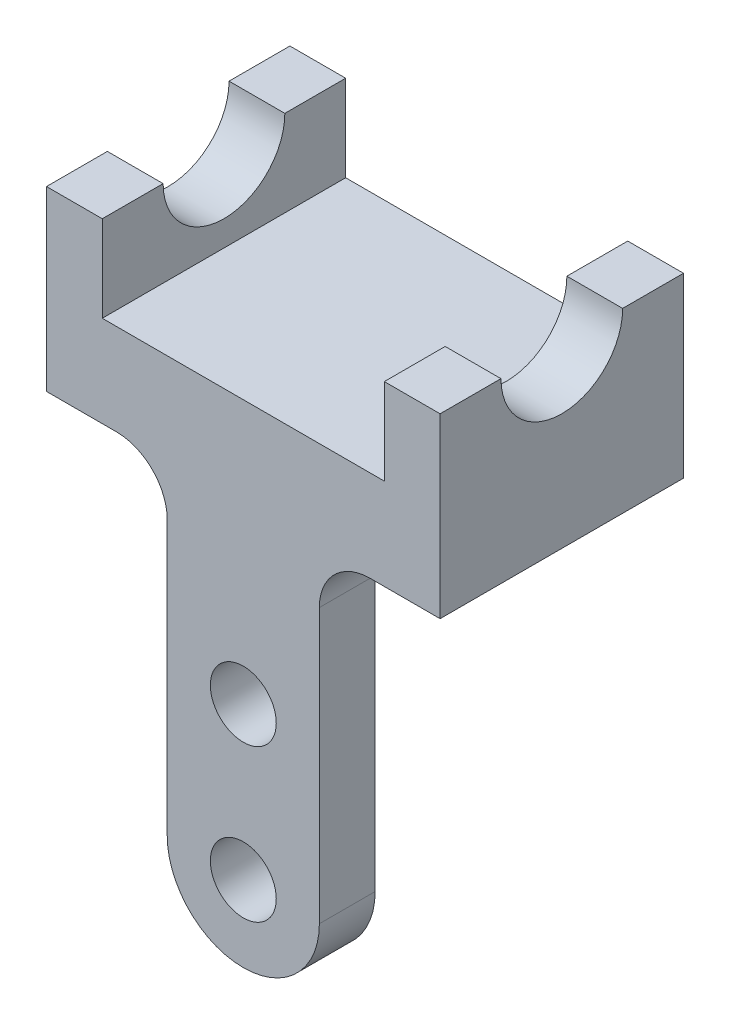
ISO-10303-21;
HEADER;
FILE_DESCRIPTION(('STEP AP214'),'2;1');
FILE_NAME('part.step','',(''),(''),'','','');
FILE_SCHEMA(('AUTOMOTIVE_DESIGN { 1 0 10303 214 1 1 1 1 }'));
ENDSEC;
DATA;
#1=APPLICATION_CONTEXT('core data for automotive mechanical design processes');
#2=APPLICATION_PROTOCOL_DEFINITION('international standard','automotive_design',2000,#1);
#3=PRODUCT_CONTEXT('',#1,'mechanical');
#4=PRODUCT('Part','Part','',(#3));
#5=PRODUCT_RELATED_PRODUCT_CATEGORY('part','',(#4));
#6=PRODUCT_DEFINITION_FORMATION('','',#4);
#7=PRODUCT_DEFINITION_CONTEXT('part definition',#1,'design');
#8=PRODUCT_DEFINITION('design','',#6,#7);
#9=PRODUCT_DEFINITION_SHAPE('','',#8);
#10=(LENGTH_UNIT() NAMED_UNIT(*) SI_UNIT(.MILLI.,.METRE.));
#11=(NAMED_UNIT(*) PLANE_ANGLE_UNIT() SI_UNIT($,.RADIAN.));
#12=(NAMED_UNIT(*) SI_UNIT($,.STERADIAN.) SOLID_ANGLE_UNIT());
#13=UNCERTAINTY_MEASURE_WITH_UNIT(LENGTH_MEASURE(1.E-05),#10,'distance_accuracy_value','');
#14=(GEOMETRIC_REPRESENTATION_CONTEXT(3) GLOBAL_UNCERTAINTY_ASSIGNED_CONTEXT((#13)) GLOBAL_UNIT_ASSIGNED_CONTEXT((#10,
#11,#12)) REPRESENTATION_CONTEXT('',''));
#15=CARTESIAN_POINT('',(0.,0.,0.));
#16=DIRECTION('',(0.,0.,1.));
#17=DIRECTION('',(1.,0.,0.));
#18=AXIS2_PLACEMENT_3D('',#15,#16,#17);
#19=CARTESIAN_POINT('',(0.,99.,-48.));
#20=DIRECTION('',(0.,1.,0.));
#21=DIRECTION('',(0.,0.,1.));
#22=AXIS2_PLACEMENT_3D('',#19,#20,#21);
#23=PLANE('',#22);
#24=DIRECTION('',(1.,0.,0.));
#25=VECTOR('',#24,1.);
#26=CARTESIAN_POINT('',(-38.8107599552078,99.,-12.));
#27=LINE('',#26,#25);
#28=CARTESIAN_POINT('',(27.8107599552078,99.,-12.));
#29=VERTEX_POINT('',#28);
#30=CARTESIAN_POINT('',(38.8107599552078,99.,-12.));
#31=VERTEX_POINT('',#30);
#32=EDGE_CURVE('E371',#29,#31,#27,.T.);
#33=ORIENTED_EDGE('',*,*,#32,.F.);
#34=DIRECTION('',(0.,0.,1.));
#35=VECTOR('',#34,1.);
#36=CARTESIAN_POINT('',(27.8107599552078,99.,-48.));
#37=LINE('',#36,#35);
#38=CARTESIAN_POINT('',(27.8107599552078,99.,0.));
#39=VERTEX_POINT('',#38);
#40=EDGE_CURVE('E288',#29,#39,#37,.T.);
#41=ORIENTED_EDGE('',*,*,#40,.T.);
#42=DIRECTION('',(-1.,0.,0.));
#43=VECTOR('',#42,1.);
#44=CARTESIAN_POINT('',(0.,99.,0.));
#45=LINE('',#44,#43);
#46=CARTESIAN_POINT('',(38.8107599552078,99.,0.));
#47=VERTEX_POINT('',#46);
#48=EDGE_CURVE('E274',#47,#39,#45,.T.);
#49=ORIENTED_EDGE('',*,*,#48,.F.);
#50=DIRECTION('',(0.,0.,1.));
#51=VECTOR('',#50,1.);
#52=CARTESIAN_POINT('',(38.8107599552078,99.,-48.));
#53=LINE('',#52,#51);
#54=EDGE_CURVE('E289',#31,#47,#53,.T.);
#55=ORIENTED_EDGE('',*,*,#54,.F.);
#56=EDGE_LOOP('',(#33,#41,#49,#55));
#57=FACE_BOUND('',#56,.T.);
#58=ADVANCED_FACE('F39',(#57),#23,.T.);
#59=CARTESIAN_POINT('',(0.,99.,-48.));
#60=DIRECTION('',(0.,-1.,0.));
#61=DIRECTION('',(0.,0.,-1.));
#62=AXIS2_PLACEMENT_3D('',#59,#60,#61);
#63=PLANE('',#62);
#64=DIRECTION('',(0.,0.,1.));
#65=VECTOR('',#64,1.);
#66=CARTESIAN_POINT('',(-38.8107599552078,99.,-48.));
#67=LINE('',#66,#65);
#68=CARTESIAN_POINT('',(-38.8107599552078,99.,-48.));
#69=VERTEX_POINT('',#68);
#70=CARTESIAN_POINT('',(-38.8107599552078,99.,-36.));
#71=VERTEX_POINT('',#70);
#72=EDGE_CURVE('E178',#69,#71,#67,.T.);
#73=ORIENTED_EDGE('',*,*,#72,.T.);
#74=DIRECTION('',(1.,0.,0.));
#75=VECTOR('',#74,1.);
#76=CARTESIAN_POINT('',(-38.8107599552078,99.,-36.));
#77=LINE('',#76,#75);
#78=CARTESIAN_POINT('',(-27.8107599552078,99.,-36.));
#79=VERTEX_POINT('',#78);
#80=EDGE_CURVE('E161',#71,#79,#77,.T.);
#81=ORIENTED_EDGE('',*,*,#80,.T.);
#82=DIRECTION('',(0.,0.,1.));
#83=VECTOR('',#82,1.);
#84=CARTESIAN_POINT('',(-27.8107599552078,99.,-48.));
#85=LINE('',#84,#83);
#86=CARTESIAN_POINT('',(-27.8107599552078,99.,-48.));
#87=VERTEX_POINT('',#86);
#88=EDGE_CURVE('E189',#87,#79,#85,.T.);
#89=ORIENTED_EDGE('',*,*,#88,.F.);
#90=DIRECTION('',(1.,0.,0.));
#91=VECTOR('',#90,1.);
#92=CARTESIAN_POINT('',(0.,99.,-48.));
#93=LINE('',#92,#91);
#94=EDGE_CURVE('E185',#69,#87,#93,.T.);
#95=ORIENTED_EDGE('',*,*,#94,.F.);
#96=EDGE_LOOP('',(#73,#81,#89,#95));
#97=FACE_BOUND('',#96,.T.);
#98=ADVANCED_FACE('F182',(#97),#63,.F.);
#99=CARTESIAN_POINT('',(25.,54.,-11.));
#100=DIRECTION('',(0.,0.,1.));
#101=DIRECTION('',(1.,0.,0.));
#102=AXIS2_PLACEMENT_3D('',#99,#100,#101);
#103=CYLINDRICAL_SURFACE('',#102,9.99999999999999);
#104=CARTESIAN_POINT('',(25.,54.,0.));
#105=DIRECTION('',(0.,0.,1.));
#106=DIRECTION('',(1.,0.,0.));
#107=AXIS2_PLACEMENT_3D('',#104,#105,#106);
#108=CIRCLE('',#107,9.99999999999999);
#109=CARTESIAN_POINT('',(15.,54.,0.));
#110=VERTEX_POINT('',#109);
#111=CARTESIAN_POINT('',(25.,64.,0.));
#112=VERTEX_POINT('',#111);
#113=EDGE_CURVE('E199',#110,#112,#108,.F.);
#114=ORIENTED_EDGE('',*,*,#113,.F.);
#115=DIRECTION('',(0.,0.,1.));
#116=VECTOR('',#115,1.);
#117=CARTESIAN_POINT('',(15.,54.,-11.));
#118=LINE('',#117,#116);
#119=CARTESIAN_POINT('',(15.,54.,-11.));
#120=VERTEX_POINT('',#119);
#121=EDGE_CURVE('E244',#120,#110,#118,.T.);
#122=ORIENTED_EDGE('',*,*,#121,.F.);
#123=CARTESIAN_POINT('',(25.,54.,-11.));
#124=DIRECTION('',(0.,0.,1.));
#125=DIRECTION('',(1.,0.,0.));
#126=AXIS2_PLACEMENT_3D('',#123,#124,#125);
#127=CIRCLE('',#126,9.99999999999999);
#128=CARTESIAN_POINT('',(25.,64.,-11.));
#129=VERTEX_POINT('',#128);
#130=EDGE_CURVE('E217',#120,#129,#127,.F.);
#131=ORIENTED_EDGE('',*,*,#130,.T.);
#132=DIRECTION('',(0.,0.,1.));
#133=VECTOR('',#132,1.);
#134=CARTESIAN_POINT('',(25.,64.,-11.));
#135=LINE('',#134,#133);
#136=EDGE_CURVE('E50',#129,#112,#135,.T.);
#137=ORIENTED_EDGE('',*,*,#136,.T.);
#138=EDGE_LOOP('',(#114,#122,#131,#137));
#139=FACE_BOUND('',#138,.T.);
#140=ADVANCED_FACE('F301',(#139),#103,.F.);
#141=CARTESIAN_POINT('',(15.,0.,-11.));
#142=DIRECTION('',(1.,0.,0.));
#143=DIRECTION('',(0.,0.,-1.));
#144=AXIS2_PLACEMENT_3D('',#141,#142,#143);
#145=PLANE('',#144);
#146=DIRECTION('',(0.,1.,0.));
#147=VECTOR('',#146,1.);
#148=CARTESIAN_POINT('',(15.,0.,0.));
#149=LINE('',#148,#147);
#150=CARTESIAN_POINT('',(15.,0.,0.));
#151=VERTEX_POINT('',#150);
#152=EDGE_CURVE('E240',#151,#110,#149,.T.);
#153=ORIENTED_EDGE('',*,*,#152,.F.);
#154=DIRECTION('',(0.,0.,1.));
#155=VECTOR('',#154,1.);
#156=CARTESIAN_POINT('',(15.,0.,-11.));
#157=LINE('',#156,#155);
#158=CARTESIAN_POINT('',(15.,0.,-11.));
#159=VERTEX_POINT('',#158);
#160=EDGE_CURVE('E243',#159,#151,#157,.T.);
#161=ORIENTED_EDGE('',*,*,#160,.F.);
#162=DIRECTION('',(0.,1.,0.));
#163=VECTOR('',#162,1.);
#164=CARTESIAN_POINT('',(15.,0.,-11.));
#165=LINE('',#164,#163);
#166=EDGE_CURVE('E214',#159,#120,#165,.T.);
#167=ORIENTED_EDGE('',*,*,#166,.T.);
#168=ORIENTED_EDGE('',*,*,#121,.T.);
#169=EDGE_LOOP('',(#153,#161,#167,#168));
#170=FACE_BOUND('',#169,.T.);
#171=ADVANCED_FACE('F317',(#170),#145,.T.);
#172=CARTESIAN_POINT('',(0.,0.,-11.));
#173=DIRECTION('',(0.,0.,1.));
#174=DIRECTION('',(1.,0.,0.));
#175=AXIS2_PLACEMENT_3D('',#172,#173,#174);
#176=CYLINDRICAL_SURFACE('',#175,15.);
#177=CARTESIAN_POINT('',(0.,0.,0.));
#178=DIRECTION('',(0.,0.,1.));
#179=DIRECTION('',(1.,0.,0.));
#180=AXIS2_PLACEMENT_3D('',#177,#178,#179);
#181=CIRCLE('',#180,15.);
#182=CARTESIAN_POINT('',(-15.,0.,0.));
#183=VERTEX_POINT('',#182);
#184=EDGE_CURVE('E234',#183,#151,#181,.T.);
#185=ORIENTED_EDGE('',*,*,#184,.F.);
#186=DIRECTION('',(0.,0.,1.));
#187=VECTOR('',#186,1.);
#188=CARTESIAN_POINT('',(-15.,0.,-11.));
#189=LINE('',#188,#187);
#190=CARTESIAN_POINT('',(-15.,0.,-11.));
#191=VERTEX_POINT('',#190);
#192=EDGE_CURVE('E250',#191,#183,#189,.T.);
#193=ORIENTED_EDGE('',*,*,#192,.F.);
#194=CARTESIAN_POINT('',(0.,0.,-11.));
#195=DIRECTION('',(0.,0.,1.));
#196=DIRECTION('',(1.,0.,0.));
#197=AXIS2_PLACEMENT_3D('',#194,#195,#196);
#198=CIRCLE('',#197,15.);
#199=EDGE_CURVE('E215',#191,#159,#198,.T.);
#200=ORIENTED_EDGE('',*,*,#199,.T.);
#201=ORIENTED_EDGE('',*,*,#160,.T.);
#202=EDGE_LOOP('',(#185,#193,#200,#201));
#203=FACE_BOUND('',#202,.T.);
#204=ADVANCED_FACE('F316',(#203),#176,.T.);
#205=CARTESIAN_POINT('',(-15.,0.,-11.));
#206=DIRECTION('',(1.,0.,0.));
#207=DIRECTION('',(0.,0.,-1.));
#208=AXIS2_PLACEMENT_3D('',#205,#206,#207);
#209=PLANE('',#208);
#210=DIRECTION('',(0.,1.,0.));
#211=VECTOR('',#210,1.);
#212=CARTESIAN_POINT('',(-15.,0.,0.));
#213=LINE('',#212,#211);
#214=CARTESIAN_POINT('',(-15.,54.,0.));
#215=VERTEX_POINT('',#214);
#216=EDGE_CURVE('E233',#183,#215,#213,.T.);
#217=ORIENTED_EDGE('',*,*,#216,.T.);
#218=DIRECTION('',(0.,0.,1.));
#219=VECTOR('',#218,1.);
#220=CARTESIAN_POINT('',(-15.,54.,-11.));
#221=LINE('',#220,#219);
#222=CARTESIAN_POINT('',(-15.,54.,-11.));
#223=VERTEX_POINT('',#222);
#224=EDGE_CURVE('E249',#223,#215,#221,.T.);
#225=ORIENTED_EDGE('',*,*,#224,.F.);
#226=DIRECTION('',(0.,1.,0.));
#227=VECTOR('',#226,1.);
#228=CARTESIAN_POINT('',(-15.,0.,-11.));
#229=LINE('',#228,#227);
#230=EDGE_CURVE('E207',#191,#223,#229,.T.);
#231=ORIENTED_EDGE('',*,*,#230,.F.);
#232=ORIENTED_EDGE('',*,*,#192,.T.);
#233=EDGE_LOOP('',(#217,#225,#231,#232));
#234=FACE_BOUND('',#233,.T.);
#235=ADVANCED_FACE('F311',(#234),#209,.F.);
#236=CARTESIAN_POINT('',(0.,0.,-11.));
#237=DIRECTION('',(0.,0.,1.));
#238=DIRECTION('',(1.,0.,0.));
#239=AXIS2_PLACEMENT_3D('',#236,#237,#238);
#240=CYLINDRICAL_SURFACE('',#239,6.5);
#241=CARTESIAN_POINT('',(0.,0.,-11.));
#242=DIRECTION('',(0.,0.,1.));
#243=DIRECTION('',(1.,0.,0.));
#244=AXIS2_PLACEMENT_3D('',#241,#242,#243);
#245=CIRCLE('',#244,6.5);
#246=CARTESIAN_POINT('',(6.5,0.,-11.));
#247=VERTEX_POINT('',#246);
#248=EDGE_CURVE('E200',#247,#247,#245,.T.);
#249=ORIENTED_EDGE('',*,*,#248,.F.);
#250=EDGE_LOOP('',(#249));
#251=FACE_BOUND('',#250,.T.);
#252=CARTESIAN_POINT('',(0.,0.,0.));
#253=DIRECTION('',(0.,0.,1.));
#254=DIRECTION('',(1.,0.,0.));
#255=AXIS2_PLACEMENT_3D('',#252,#253,#254);
#256=CIRCLE('',#255,6.5);
#257=CARTESIAN_POINT('',(6.5,0.,0.));
#258=VERTEX_POINT('',#257);
#259=EDGE_CURVE('E223',#258,#258,#256,.T.);
#260=ORIENTED_EDGE('',*,*,#259,.T.);
#261=EDGE_LOOP('',(#260));
#262=FACE_BOUND('',#261,.T.);
#263=ADVANCED_FACE('F422',(#251,#262),#240,.F.);
#264=CARTESIAN_POINT('',(0.,30.,-11.));
#265=DIRECTION('',(0.,0.,1.));
#266=DIRECTION('',(1.,0.,0.));
#267=AXIS2_PLACEMENT_3D('',#264,#265,#266);
#268=CYLINDRICAL_SURFACE('',#267,6.5);
#269=CARTESIAN_POINT('',(0.,30.,-11.));
#270=DIRECTION('',(0.,0.,1.));
#271=DIRECTION('',(1.,0.,0.));
#272=AXIS2_PLACEMENT_3D('',#269,#270,#271);
#273=CIRCLE('',#272,6.5);
#274=CARTESIAN_POINT('',(6.50000000000001,30.,-11.));
#275=VERTEX_POINT('',#274);
#276=EDGE_CURVE('E198',#275,#275,#273,.T.);
#277=ORIENTED_EDGE('',*,*,#276,.F.);
#278=EDGE_LOOP('',(#277));
#279=FACE_BOUND('',#278,.T.);
#280=CARTESIAN_POINT('',(0.,30.,0.));
#281=DIRECTION('',(0.,0.,1.));
#282=DIRECTION('',(1.,0.,0.));
#283=AXIS2_PLACEMENT_3D('',#280,#281,#282);
#284=CIRCLE('',#283,6.5);
#285=CARTESIAN_POINT('',(6.50000000000001,30.,0.));
#286=VERTEX_POINT('',#285);
#287=EDGE_CURVE('E225',#286,#286,#284,.T.);
#288=ORIENTED_EDGE('',*,*,#287,.T.);
#289=EDGE_LOOP('',(#288));
#290=FACE_BOUND('',#289,.T.);
#291=ADVANCED_FACE('F41',(#279,#290),#268,.F.);
#292=CARTESIAN_POINT('',(-25.,54.,-11.));
#293=DIRECTION('',(0.,0.,1.));
#294=DIRECTION('',(1.,0.,0.));
#295=AXIS2_PLACEMENT_3D('',#292,#293,#294);
#296=CYLINDRICAL_SURFACE('',#295,9.99999999999999);
#297=CARTESIAN_POINT('',(-25.,54.,0.));
#298=DIRECTION('',(0.,0.,1.));
#299=DIRECTION('',(1.,0.,0.));
#300=AXIS2_PLACEMENT_3D('',#297,#298,#299);
#301=CIRCLE('',#300,9.99999999999999);
#302=CARTESIAN_POINT('',(-25.,64.,0.));
#303=VERTEX_POINT('',#302);
#304=EDGE_CURVE('E226',#215,#303,#301,.T.);
#305=ORIENTED_EDGE('',*,*,#304,.T.);
#306=DIRECTION('',(0.,0.,1.));
#307=VECTOR('',#306,1.);
#308=CARTESIAN_POINT('',(-25.,64.,-11.));
#309=LINE('',#308,#307);
#310=CARTESIAN_POINT('',(-25.,64.,-11.));
#311=VERTEX_POINT('',#310);
#312=EDGE_CURVE('E222',#311,#303,#309,.T.);
#313=ORIENTED_EDGE('',*,*,#312,.F.);
#314=CARTESIAN_POINT('',(-25.,54.,-11.));
#315=DIRECTION('',(0.,0.,1.));
#316=DIRECTION('',(1.,0.,0.));
#317=AXIS2_PLACEMENT_3D('',#314,#315,#316);
#318=CIRCLE('',#317,9.99999999999999);
#319=EDGE_CURVE('E206',#223,#311,#318,.T.);
#320=ORIENTED_EDGE('',*,*,#319,.F.);
#321=ORIENTED_EDGE('',*,*,#224,.T.);
#322=EDGE_LOOP('',(#305,#313,#320,#321));
#323=FACE_BOUND('',#322,.T.);
#324=ADVANCED_FACE('F313',(#323),#296,.F.);
#325=CARTESIAN_POINT('',(0.,0.,-11.));
#326=DIRECTION('',(0.,0.,1.));
#327=DIRECTION('',(1.,0.,0.));
#328=AXIS2_PLACEMENT_3D('',#325,#326,#327);
#329=PLANE('',#328);
#330=ORIENTED_EDGE('',*,*,#276,.T.);
#331=EDGE_LOOP('',(#330));
#332=FACE_BOUND('',#331,.T.);
#333=ORIENTED_EDGE('',*,*,#248,.T.);
#334=EDGE_LOOP('',(#333));
#335=FACE_BOUND('',#334,.T.);
#336=DIRECTION('',(-1.,0.,0.));
#337=VECTOR('',#336,1.);
#338=CARTESIAN_POINT('',(0.,64.,-11.));
#339=LINE('',#338,#337);
#340=EDGE_CURVE('E201',#129,#311,#339,.T.);
#341=ORIENTED_EDGE('',*,*,#340,.F.);
#342=ORIENTED_EDGE('',*,*,#130,.F.);
#343=ORIENTED_EDGE('',*,*,#166,.F.);
#344=ORIENTED_EDGE('',*,*,#199,.F.);
#345=ORIENTED_EDGE('',*,*,#230,.T.);
#346=ORIENTED_EDGE('',*,*,#319,.T.);
#347=EDGE_LOOP('',(#341,#342,#343,#344,#345,#346));
#348=FACE_BOUND('',#347,.T.);
#349=ADVANCED_FACE('F307',(#332,#335,#348),#329,.F.);
#350=CARTESIAN_POINT('',(0.,0.,0.));
#351=DIRECTION('',(0.,0.,1.));
#352=DIRECTION('',(1.,0.,0.));
#353=AXIS2_PLACEMENT_3D('',#350,#351,#352);
#354=PLANE('',#353);
#355=ORIENTED_EDGE('',*,*,#287,.F.);
#356=EDGE_LOOP('',(#355));
#357=FACE_BOUND('',#356,.T.);
#358=ORIENTED_EDGE('',*,*,#259,.F.);
#359=EDGE_LOOP('',(#358));
#360=FACE_BOUND('',#359,.T.);
#361=ORIENTED_EDGE('',*,*,#113,.T.);
#362=DIRECTION('',(-1.,0.,0.));
#363=VECTOR('',#362,1.);
#364=CARTESIAN_POINT('',(0.,64.,0.));
#365=LINE('',#364,#363);
#366=CARTESIAN_POINT('',(38.8107599552078,64.,0.));
#367=VERTEX_POINT('',#366);
#368=EDGE_CURVE('E264',#367,#112,#365,.T.);
#369=ORIENTED_EDGE('',*,*,#368,.F.);
#370=DIRECTION('',(0.,1.,0.));
#371=VECTOR('',#370,1.);
#372=CARTESIAN_POINT('',(38.8107599552078,0.,0.));
#373=LINE('',#372,#371);
#374=EDGE_CURVE('E268',#367,#47,#373,.T.);
#375=ORIENTED_EDGE('',*,*,#374,.T.);
#376=ORIENTED_EDGE('',*,*,#48,.T.);
#377=DIRECTION('',(0.,-1.,0.));
#378=VECTOR('',#377,1.);
#379=CARTESIAN_POINT('',(27.8107599552079,0.,0.));
#380=LINE('',#379,#378);
#381=CARTESIAN_POINT('',(27.8107599552078,82.,0.));
#382=VERTEX_POINT('',#381);
#383=EDGE_CURVE('E279',#39,#382,#380,.T.);
#384=ORIENTED_EDGE('',*,*,#383,.T.);
#385=DIRECTION('',(-1.,0.,0.));
#386=VECTOR('',#385,1.);
#387=CARTESIAN_POINT('',(0.,82.,0.));
#388=LINE('',#387,#386);
#389=CARTESIAN_POINT('',(-27.8107599552078,82.,0.));
#390=VERTEX_POINT('',#389);
#391=EDGE_CURVE('E370',#382,#390,#388,.T.);
#392=ORIENTED_EDGE('',*,*,#391,.T.);
#393=DIRECTION('',(0.,-1.,0.));
#394=VECTOR('',#393,1.);
#395=CARTESIAN_POINT('',(-27.8107599552079,0.,0.));
#396=LINE('',#395,#394);
#397=CARTESIAN_POINT('',(-27.8107599552078,99.,0.));
#398=VERTEX_POINT('',#397);
#399=EDGE_CURVE('E367',#398,#390,#396,.T.);
#400=ORIENTED_EDGE('',*,*,#399,.F.);
#401=DIRECTION('',(1.,0.,0.));
#402=VECTOR('',#401,1.);
#403=CARTESIAN_POINT('',(0.,99.,0.));
#404=LINE('',#403,#402);
#405=CARTESIAN_POINT('',(-38.8107599552078,99.,0.));
#406=VERTEX_POINT('',#405);
#407=EDGE_CURVE('E267',#406,#398,#404,.T.);
#408=ORIENTED_EDGE('',*,*,#407,.F.);
#409=DIRECTION('',(0.,1.,0.));
#410=VECTOR('',#409,1.);
#411=CARTESIAN_POINT('',(-38.8107599552078,0.,0.));
#412=LINE('',#411,#410);
#413=CARTESIAN_POINT('',(-38.8107599552078,64.,0.));
#414=VERTEX_POINT('',#413);
#415=EDGE_CURVE('E262',#414,#406,#412,.T.);
#416=ORIENTED_EDGE('',*,*,#415,.F.);
#417=EDGE_CURVE('E260',#303,#414,#365,.T.);
#418=ORIENTED_EDGE('',*,*,#417,.F.);
#419=ORIENTED_EDGE('',*,*,#304,.F.);
#420=ORIENTED_EDGE('',*,*,#216,.F.);
#421=ORIENTED_EDGE('',*,*,#184,.T.);
#422=ORIENTED_EDGE('',*,*,#152,.T.);
#423=EDGE_LOOP('',(#361,#369,#375,#376,#384,#392,#400,#408,#416,#418,#419,#420,#421,#422));
#424=FACE_BOUND('',#423,.T.);
#425=ADVANCED_FACE('F261',(#357,#360,#424),#354,.T.);
#426=CARTESIAN_POINT('',(0.,82.,-48.));
#427=DIRECTION('',(0.,1.,0.));
#428=DIRECTION('',(0.,0.,1.));
#429=AXIS2_PLACEMENT_3D('',#426,#427,#428);
#430=PLANE('',#429);
#431=ORIENTED_EDGE('',*,*,#391,.F.);
#432=DIRECTION('',(0.,0.,1.));
#433=VECTOR('',#432,1.);
#434=CARTESIAN_POINT('',(27.8107599552078,82.,-48.));
#435=LINE('',#434,#433);
#436=CARTESIAN_POINT('',(27.8107599552078,82.,-48.));
#437=VERTEX_POINT('',#436);
#438=EDGE_CURVE('E227',#437,#382,#435,.T.);
#439=ORIENTED_EDGE('',*,*,#438,.F.);
#440=DIRECTION('',(-1.,0.,0.));
#441=VECTOR('',#440,1.);
#442=CARTESIAN_POINT('',(0.,82.,-48.));
#443=LINE('',#442,#441);
#444=CARTESIAN_POINT('',(-27.8107599552078,82.,-48.));
#445=VERTEX_POINT('',#444);
#446=EDGE_CURVE('E282',#437,#445,#443,.T.);
#447=ORIENTED_EDGE('',*,*,#446,.T.);
#448=DIRECTION('',(0.,0.,1.));
#449=VECTOR('',#448,1.);
#450=CARTESIAN_POINT('',(-27.8107599552078,82.,-48.));
#451=LINE('',#450,#449);
#452=EDGE_CURVE('E191',#445,#390,#451,.T.);
#453=ORIENTED_EDGE('',*,*,#452,.T.);
#454=EDGE_LOOP('',(#431,#439,#447,#453));
#455=FACE_BOUND('',#454,.T.);
#456=ADVANCED_FACE('F347',(#455),#430,.T.);
#457=CARTESIAN_POINT('',(27.8107599552079,0.,-48.));
#458=DIRECTION('',(-1.,0.,0.));
#459=DIRECTION('',(0.,-1.,0.));
#460=AXIS2_PLACEMENT_3D('',#457,#458,#459);
#461=PLANE('',#460);
#462=CARTESIAN_POINT('',(27.8107599552078,99.,-24.));
#463=DIRECTION('',(-1.,0.,0.));
#464=DIRECTION('',(0.,-1.,0.));
#465=AXIS2_PLACEMENT_3D('',#462,#463,#464);
#466=CIRCLE('',#465,12.);
#467=CARTESIAN_POINT('',(27.8107599552078,99.,-36.));
#468=VERTEX_POINT('',#467);
#469=EDGE_CURVE('E352',#468,#29,#466,.T.);
#470=ORIENTED_EDGE('',*,*,#469,.F.);
#471=CARTESIAN_POINT('',(27.8107599552078,99.,-48.));
#472=VERTEX_POINT('',#471);
#473=EDGE_CURVE('E284',#472,#468,#37,.T.);
#474=ORIENTED_EDGE('',*,*,#473,.F.);
#475=DIRECTION('',(0.,-1.,0.));
#476=VECTOR('',#475,1.);
#477=CARTESIAN_POINT('',(27.8107599552079,0.,-48.));
#478=LINE('',#477,#476);
#479=EDGE_CURVE('E192',#472,#437,#478,.T.);
#480=ORIENTED_EDGE('',*,*,#479,.T.);
#481=ORIENTED_EDGE('',*,*,#438,.T.);
#482=ORIENTED_EDGE('',*,*,#383,.F.);
#483=ORIENTED_EDGE('',*,*,#40,.F.);
#484=EDGE_LOOP('',(#470,#474,#480,#481,#482,#483));
#485=FACE_BOUND('',#484,.T.);
#486=ADVANCED_FACE('F338',(#485),#461,.T.);
#487=DIRECTION('',(1.,0.,0.));
#488=VECTOR('',#487,1.);
#489=CARTESIAN_POINT('',(-38.8107599552078,99.,-36.));
#490=LINE('',#489,#488);
#491=CARTESIAN_POINT('',(38.8107599552078,99.,-36.));
#492=VERTEX_POINT('',#491);
#493=EDGE_CURVE('E166',#492,#468,#490,.F.);
#494=ORIENTED_EDGE('',*,*,#493,.F.);
#495=CARTESIAN_POINT('',(38.8107599552078,99.,-48.));
#496=VERTEX_POINT('',#495);
#497=EDGE_CURVE('E290',#496,#492,#53,.T.);
#498=ORIENTED_EDGE('',*,*,#497,.F.);
#499=DIRECTION('',(-1.,0.,0.));
#500=VECTOR('',#499,1.);
#501=CARTESIAN_POINT('',(0.,99.,-48.));
#502=LINE('',#501,#500);
#503=EDGE_CURVE('E360',#496,#472,#502,.T.);
#504=ORIENTED_EDGE('',*,*,#503,.T.);
#505=ORIENTED_EDGE('',*,*,#473,.T.);
#506=EDGE_LOOP('',(#494,#498,#504,#505));
#507=FACE_BOUND('',#506,.T.);
#508=ADVANCED_FACE('F329',(#507),#23,.T.);
#509=CARTESIAN_POINT('',(38.8107599552078,0.,-48.));
#510=DIRECTION('',(1.,0.,0.));
#511=DIRECTION('',(0.,0.,-1.));
#512=AXIS2_PLACEMENT_3D('',#509,#510,#511);
#513=PLANE('',#512);
#514=CARTESIAN_POINT('',(38.8107599552078,99.,-24.));
#515=DIRECTION('',(1.,0.,0.));
#516=DIRECTION('',(0.,0.,-1.));
#517=AXIS2_PLACEMENT_3D('',#514,#515,#516);
#518=CIRCLE('',#517,12.);
#519=EDGE_CURVE('E53',#31,#492,#518,.T.);
#520=ORIENTED_EDGE('',*,*,#519,.F.);
#521=ORIENTED_EDGE('',*,*,#54,.T.);
#522=ORIENTED_EDGE('',*,*,#374,.F.);
#523=DIRECTION('',(0.,0.,1.));
#524=VECTOR('',#523,1.);
#525=CARTESIAN_POINT('',(38.8107599552078,64.,-48.));
#526=LINE('',#525,#524);
#527=CARTESIAN_POINT('',(38.8107599552078,64.,-48.));
#528=VERTEX_POINT('',#527);
#529=EDGE_CURVE('E187',#528,#367,#526,.T.);
#530=ORIENTED_EDGE('',*,*,#529,.F.);
#531=DIRECTION('',(0.,1.,0.));
#532=VECTOR('',#531,1.);
#533=CARTESIAN_POINT('',(38.8107599552078,0.,-48.));
#534=LINE('',#533,#532);
#535=EDGE_CURVE('E353',#528,#496,#534,.T.);
#536=ORIENTED_EDGE('',*,*,#535,.T.);
#537=ORIENTED_EDGE('',*,*,#497,.T.);
#538=EDGE_LOOP('',(#520,#521,#522,#530,#536,#537));
#539=FACE_BOUND('',#538,.T.);
#540=ADVANCED_FACE('F297',(#539),#513,.T.);
#541=CARTESIAN_POINT('',(0.,64.,-48.));
#542=DIRECTION('',(0.,1.,0.));
#543=DIRECTION('',(0.,0.,1.));
#544=AXIS2_PLACEMENT_3D('',#541,#542,#543);
#545=PLANE('',#544);
#546=ORIENTED_EDGE('',*,*,#136,.F.);
#547=ORIENTED_EDGE('',*,*,#340,.T.);
#548=ORIENTED_EDGE('',*,*,#312,.T.);
#549=ORIENTED_EDGE('',*,*,#417,.T.);
#550=DIRECTION('',(0.,0.,1.));
#551=VECTOR('',#550,1.);
#552=CARTESIAN_POINT('',(-38.8107599552078,64.,-48.));
#553=LINE('',#552,#551);
#554=CARTESIAN_POINT('',(-38.8107599552078,64.,-48.));
#555=VERTEX_POINT('',#554);
#556=EDGE_CURVE('E181',#555,#414,#553,.T.);
#557=ORIENTED_EDGE('',*,*,#556,.F.);
#558=DIRECTION('',(-1.,0.,0.));
#559=VECTOR('',#558,1.);
#560=CARTESIAN_POINT('',(0.,64.,-48.));
#561=LINE('',#560,#559);
#562=EDGE_CURVE('E356',#528,#555,#561,.T.);
#563=ORIENTED_EDGE('',*,*,#562,.F.);
#564=ORIENTED_EDGE('',*,*,#529,.T.);
#565=ORIENTED_EDGE('',*,*,#368,.T.);
#566=EDGE_LOOP('',(#546,#547,#548,#549,#557,#563,#564,#565));
#567=FACE_BOUND('',#566,.T.);
#568=ADVANCED_FACE('F254',(#567),#545,.F.);
#569=CARTESIAN_POINT('',(-38.8107599552078,0.,-48.));
#570=DIRECTION('',(1.,0.,0.));
#571=DIRECTION('',(0.,0.,-1.));
#572=AXIS2_PLACEMENT_3D('',#569,#570,#571);
#573=PLANE('',#572);
#574=CARTESIAN_POINT('',(-38.8107599552078,99.,-12.));
#575=VERTEX_POINT('',#574);
#576=EDGE_CURVE('E179',#575,#406,#67,.T.);
#577=ORIENTED_EDGE('',*,*,#576,.F.);
#578=CARTESIAN_POINT('',(-38.8107599552078,99.,-24.));
#579=DIRECTION('',(1.,0.,0.));
#580=DIRECTION('',(0.,0.,-1.));
#581=AXIS2_PLACEMENT_3D('',#578,#579,#580);
#582=CIRCLE('',#581,12.);
#583=EDGE_CURVE('E163',#575,#71,#582,.T.);
#584=ORIENTED_EDGE('',*,*,#583,.T.);
#585=ORIENTED_EDGE('',*,*,#72,.F.);
#586=DIRECTION('',(0.,1.,0.));
#587=VECTOR('',#586,1.);
#588=CARTESIAN_POINT('',(-38.8107599552078,0.,-48.));
#589=LINE('',#588,#587);
#590=EDGE_CURVE('E363',#555,#69,#589,.T.);
#591=ORIENTED_EDGE('',*,*,#590,.F.);
#592=ORIENTED_EDGE('',*,*,#556,.T.);
#593=ORIENTED_EDGE('',*,*,#415,.T.);
#594=EDGE_LOOP('',(#577,#584,#585,#591,#592,#593));
#595=FACE_BOUND('',#594,.T.);
#596=ADVANCED_FACE('F171',(#595),#573,.F.);
#597=CARTESIAN_POINT('',(-27.8107599552078,99.,-12.));
#598=VERTEX_POINT('',#597);
#599=EDGE_CURVE('E195',#598,#398,#85,.T.);
#600=ORIENTED_EDGE('',*,*,#599,.F.);
#601=DIRECTION('',(1.,0.,0.));
#602=VECTOR('',#601,1.);
#603=CARTESIAN_POINT('',(-38.8107599552078,99.,-12.));
#604=LINE('',#603,#602);
#605=EDGE_CURVE('E65',#598,#575,#604,.F.);
#606=ORIENTED_EDGE('',*,*,#605,.T.);
#607=ORIENTED_EDGE('',*,*,#576,.T.);
#608=ORIENTED_EDGE('',*,*,#407,.T.);
#609=EDGE_LOOP('',(#600,#606,#607,#608));
#610=FACE_BOUND('',#609,.T.);
#611=ADVANCED_FACE('F337',(#610),#63,.F.);
#612=CARTESIAN_POINT('',(-27.8107599552079,0.,-48.));
#613=DIRECTION('',(-1.,0.,0.));
#614=DIRECTION('',(0.,-1.,0.));
#615=AXIS2_PLACEMENT_3D('',#612,#613,#614);
#616=PLANE('',#615);
#617=ORIENTED_EDGE('',*,*,#88,.T.);
#618=CARTESIAN_POINT('',(-27.8107599552078,99.,-24.));
#619=DIRECTION('',(-1.,0.,0.));
#620=DIRECTION('',(0.,-1.,0.));
#621=AXIS2_PLACEMENT_3D('',#618,#619,#620);
#622=CIRCLE('',#621,12.);
#623=EDGE_CURVE('E11',#79,#598,#622,.T.);
#624=ORIENTED_EDGE('',*,*,#623,.T.);
#625=ORIENTED_EDGE('',*,*,#599,.T.);
#626=ORIENTED_EDGE('',*,*,#399,.T.);
#627=ORIENTED_EDGE('',*,*,#452,.F.);
#628=DIRECTION('',(0.,-1.,0.));
#629=VECTOR('',#628,1.);
#630=CARTESIAN_POINT('',(-27.8107599552079,0.,-48.));
#631=LINE('',#630,#629);
#632=EDGE_CURVE('E382',#87,#445,#631,.T.);
#633=ORIENTED_EDGE('',*,*,#632,.F.);
#634=EDGE_LOOP('',(#617,#624,#625,#626,#627,#633));
#635=FACE_BOUND('',#634,.T.);
#636=ADVANCED_FACE('F379',(#635),#616,.F.);
#637=CARTESIAN_POINT('',(0.,0.,-48.));
#638=DIRECTION('',(0.,0.,1.));
#639=DIRECTION('',(1.,0.,0.));
#640=AXIS2_PLACEMENT_3D('',#637,#638,#639);
#641=PLANE('',#640);
#642=ORIENTED_EDGE('',*,*,#446,.F.);
#643=ORIENTED_EDGE('',*,*,#479,.F.);
#644=ORIENTED_EDGE('',*,*,#503,.F.);
#645=ORIENTED_EDGE('',*,*,#535,.F.);
#646=ORIENTED_EDGE('',*,*,#562,.T.);
#647=ORIENTED_EDGE('',*,*,#590,.T.);
#648=ORIENTED_EDGE('',*,*,#94,.T.);
#649=ORIENTED_EDGE('',*,*,#632,.T.);
#650=EDGE_LOOP('',(#642,#643,#644,#645,#646,#647,#648,#649));
#651=FACE_BOUND('',#650,.T.);
#652=ADVANCED_FACE('F386',(#651),#641,.F.);
#653=CARTESIAN_POINT('',(-38.8107599552078,99.,-24.));
#654=DIRECTION('',(1.,0.,0.));
#655=DIRECTION('',(0.,0.,-1.));
#656=AXIS2_PLACEMENT_3D('',#653,#654,#655);
#657=CYLINDRICAL_SURFACE('',#656,12.);
#658=ORIENTED_EDGE('',*,*,#583,.F.);
#659=ORIENTED_EDGE('',*,*,#605,.F.);
#660=ORIENTED_EDGE('',*,*,#623,.F.);
#661=ORIENTED_EDGE('',*,*,#80,.F.);
#662=EDGE_LOOP('',(#658,#659,#660,#661));
#663=FACE_BOUND('',#662,.T.);
#664=ADVANCED_FACE('F162',(#663),#657,.F.);
#665=ORIENTED_EDGE('',*,*,#32,.T.);
#666=ORIENTED_EDGE('',*,*,#519,.T.);
#667=ORIENTED_EDGE('',*,*,#493,.T.);
#668=ORIENTED_EDGE('',*,*,#469,.T.);
#669=EDGE_LOOP('',(#665,#666,#667,#668));
#670=FACE_BOUND('',#669,.T.);
#671=ADVANCED_FACE('F398',(#670),#657,.F.);
#672=CLOSED_SHELL('',(#58,#98,#140,#171,#204,#235,#263,#291,#324,#349,#425,#456,#486,#508,#540,
#568,#596,#611,#636,#652,#664,#671));
#673=MANIFOLD_SOLID_BREP('B2',#672);
#674=ADVANCED_BREP_SHAPE_REPRESENTATION('',(#18,#673),#14);
#675=SHAPE_DEFINITION_REPRESENTATION(#9,#674);
ENDSEC;
END-ISO-10303-21;
